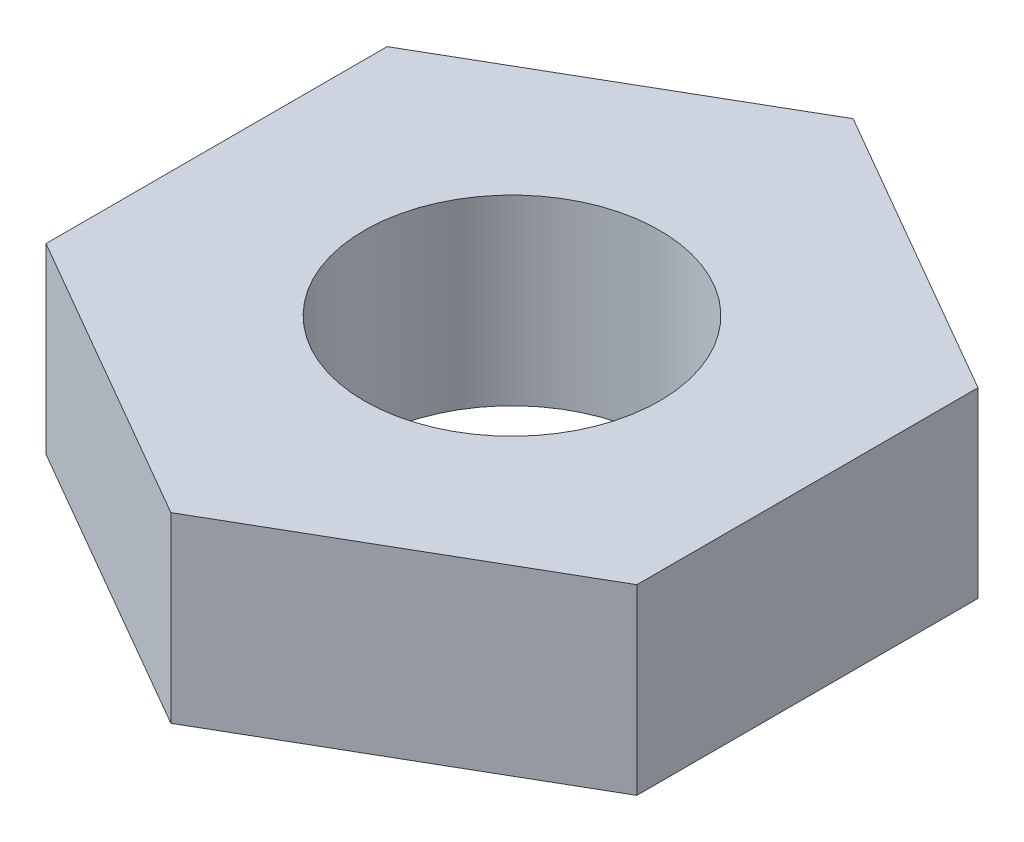
ISO-10303-21;
HEADER;
FILE_DESCRIPTION(('STEP AP214'),'2;1');
FILE_NAME('part.step','',(''),(''),'','','');
FILE_SCHEMA(('AUTOMOTIVE_DESIGN { 1 0 10303 214 1 1 1 1 }'));
ENDSEC;
DATA;
#1=APPLICATION_CONTEXT('core data for automotive mechanical design processes');
#2=APPLICATION_PROTOCOL_DEFINITION('international standard','automotive_design',2000,#1);
#3=PRODUCT_CONTEXT('',#1,'mechanical');
#4=PRODUCT('Part','Part','',(#3));
#5=PRODUCT_RELATED_PRODUCT_CATEGORY('part','',(#4));
#6=PRODUCT_DEFINITION_FORMATION('','',#4);
#7=PRODUCT_DEFINITION_CONTEXT('part definition',#1,'design');
#8=PRODUCT_DEFINITION('design','',#6,#7);
#9=PRODUCT_DEFINITION_SHAPE('','',#8);
#10=(LENGTH_UNIT() NAMED_UNIT(*) SI_UNIT(.MILLI.,.METRE.));
#11=(NAMED_UNIT(*) PLANE_ANGLE_UNIT() SI_UNIT($,.RADIAN.));
#12=(NAMED_UNIT(*) SI_UNIT($,.STERADIAN.) SOLID_ANGLE_UNIT());
#13=UNCERTAINTY_MEASURE_WITH_UNIT(LENGTH_MEASURE(1.E-05),#10,'distance_accuracy_value','');
#14=(GEOMETRIC_REPRESENTATION_CONTEXT(3) GLOBAL_UNCERTAINTY_ASSIGNED_CONTEXT((#13)) GLOBAL_UNIT_ASSIGNED_CONTEXT((#10,
#11,#12)) REPRESENTATION_CONTEXT('',''));
#15=CARTESIAN_POINT('',(0.,0.,0.));
#16=DIRECTION('',(0.,0.,1.));
#17=DIRECTION('',(1.,0.,0.));
#18=AXIS2_PLACEMENT_3D('',#15,#16,#17);
#19=CARTESIAN_POINT('',(-3.4544,2.1336,-1.99439876988864));
#20=DIRECTION('',(0.,1.,0.));
#21=DIRECTION('',(0.,0.,1.));
#22=AXIS2_PLACEMENT_3D('',#19,#20,#21);
#23=PLANE('',#22);
#24=DIRECTION('',(-0.866025403784438,0.,0.500000000000001));
#25=VECTOR('',#24,1.);
#26=CARTESIAN_POINT('',(0.,2.1336,-3.98879753977729));
#27=LINE('',#26,#25);
#28=CARTESIAN_POINT('',(0.,2.1336,-3.98879753977729));
#29=VERTEX_POINT('',#28);
#30=CARTESIAN_POINT('',(-3.4544,2.1336,-1.99439876988864));
#31=VERTEX_POINT('',#30);
#32=EDGE_CURVE('E128',#29,#31,#27,.T.);
#33=ORIENTED_EDGE('',*,*,#32,.T.);
#34=DIRECTION('',(0.,0.,1.));
#35=VECTOR('',#34,1.);
#36=CARTESIAN_POINT('',(-3.4544,2.1336,-1.99439876988864));
#37=LINE('',#36,#35);
#38=CARTESIAN_POINT('',(-3.4544,2.1336,1.99439876988865));
#39=VERTEX_POINT('',#38);
#40=EDGE_CURVE('E86',#31,#39,#37,.T.);
#41=ORIENTED_EDGE('',*,*,#40,.T.);
#42=DIRECTION('',(0.866025403784438,0.,0.500000000000001));
#43=VECTOR('',#42,1.);
#44=CARTESIAN_POINT('',(-3.4544,2.1336,1.99439876988865));
#45=LINE('',#44,#43);
#46=CARTESIAN_POINT('',(0.,2.1336,3.9887975397773));
#47=VERTEX_POINT('',#46);
#48=EDGE_CURVE('E99',#39,#47,#45,.T.);
#49=ORIENTED_EDGE('',*,*,#48,.T.);
#50=DIRECTION('',(0.866025403784438,0.,-0.500000000000001));
#51=VECTOR('',#50,1.);
#52=CARTESIAN_POINT('',(0.,2.1336,3.9887975397773));
#53=LINE('',#52,#51);
#54=CARTESIAN_POINT('',(3.4544,2.1336,1.99439876988865));
#55=VERTEX_POINT('',#54);
#56=EDGE_CURVE('E93',#47,#55,#53,.T.);
#57=ORIENTED_EDGE('',*,*,#56,.T.);
#58=DIRECTION('',(0.,0.,-1.));
#59=VECTOR('',#58,1.);
#60=CARTESIAN_POINT('',(3.4544,2.1336,-1.99439876988864));
#61=LINE('',#60,#59);
#62=CARTESIAN_POINT('',(3.4544,2.1336,-1.99439876988864));
#63=VERTEX_POINT('',#62);
#64=EDGE_CURVE('E97',#55,#63,#61,.T.);
#65=ORIENTED_EDGE('',*,*,#64,.T.);
#66=DIRECTION('',(-0.866025403784438,0.,-0.500000000000001));
#67=VECTOR('',#66,1.);
#68=CARTESIAN_POINT('',(3.4544,2.1336,-1.99439876988864));
#69=LINE('',#68,#67);
#70=EDGE_CURVE('E49',#63,#29,#69,.T.);
#71=ORIENTED_EDGE('',*,*,#70,.T.);
#72=EDGE_LOOP('',(#33,#41,#49,#57,#65,#71));
#73=FACE_BOUND('',#72,.T.);
#74=CARTESIAN_POINT('',(0.,2.1336,0.));
#75=DIRECTION('',(0.,1.,0.));
#76=DIRECTION('',(0.,0.,1.));
#77=AXIS2_PLACEMENT_3D('',#74,#75,#76);
#78=CIRCLE('',#77,1.7272);
#79=CARTESIAN_POINT('',(0.,2.1336,1.7272));
#80=VERTEX_POINT('',#79);
#81=EDGE_CURVE('E121',#80,#80,#78,.T.);
#82=ORIENTED_EDGE('',*,*,#81,.F.);
#83=EDGE_LOOP('',(#82));
#84=FACE_BOUND('',#83,.T.);
#85=ADVANCED_FACE('F32',(#73,#84),#23,.T.);
#86=CARTESIAN_POINT('',(-3.4544,0.,-1.99439876988864));
#87=DIRECTION('',(0.,1.,0.));
#88=DIRECTION('',(0.,0.,1.));
#89=AXIS2_PLACEMENT_3D('',#86,#87,#88);
#90=PLANE('',#89);
#91=DIRECTION('',(-0.866025403784438,0.,0.500000000000001));
#92=VECTOR('',#91,1.);
#93=CARTESIAN_POINT('',(0.,0.,-3.98879753977729));
#94=LINE('',#93,#92);
#95=CARTESIAN_POINT('',(0.,0.,-3.98879753977729));
#96=VERTEX_POINT('',#95);
#97=CARTESIAN_POINT('',(-3.4544,0.,-1.99439876988864));
#98=VERTEX_POINT('',#97);
#99=EDGE_CURVE('E117',#96,#98,#94,.T.);
#100=ORIENTED_EDGE('',*,*,#99,.F.);
#101=DIRECTION('',(-0.866025403784438,0.,-0.500000000000001));
#102=VECTOR('',#101,1.);
#103=CARTESIAN_POINT('',(3.4544,0.,-1.99439876988864));
#104=LINE('',#103,#102);
#105=CARTESIAN_POINT('',(3.4544,0.,-1.99439876988864));
#106=VERTEX_POINT('',#105);
#107=EDGE_CURVE('E78',#106,#96,#104,.T.);
#108=ORIENTED_EDGE('',*,*,#107,.F.);
#109=DIRECTION('',(0.,0.,-1.));
#110=VECTOR('',#109,1.);
#111=CARTESIAN_POINT('',(3.4544,0.,-1.99439876988864));
#112=LINE('',#111,#110);
#113=CARTESIAN_POINT('',(3.4544,0.,1.99439876988865));
#114=VERTEX_POINT('',#113);
#115=EDGE_CURVE('E72',#114,#106,#112,.T.);
#116=ORIENTED_EDGE('',*,*,#115,.F.);
#117=DIRECTION('',(0.866025403784438,0.,-0.500000000000001));
#118=VECTOR('',#117,1.);
#119=CARTESIAN_POINT('',(0.,0.,3.9887975397773));
#120=LINE('',#119,#118);
#121=CARTESIAN_POINT('',(0.,0.,3.9887975397773));
#122=VERTEX_POINT('',#121);
#123=EDGE_CURVE('E107',#122,#114,#120,.T.);
#124=ORIENTED_EDGE('',*,*,#123,.F.);
#125=DIRECTION('',(0.866025403784438,0.,0.500000000000001));
#126=VECTOR('',#125,1.);
#127=CARTESIAN_POINT('',(-3.4544,0.,1.99439876988865));
#128=LINE('',#127,#126);
#129=CARTESIAN_POINT('',(-3.4544,0.,1.99439876988865));
#130=VERTEX_POINT('',#129);
#131=EDGE_CURVE('E123',#130,#122,#128,.T.);
#132=ORIENTED_EDGE('',*,*,#131,.F.);
#133=DIRECTION('',(0.,0.,1.));
#134=VECTOR('',#133,1.);
#135=CARTESIAN_POINT('',(-3.4544,0.,-1.99439876988864));
#136=LINE('',#135,#134);
#137=EDGE_CURVE('E120',#98,#130,#136,.T.);
#138=ORIENTED_EDGE('',*,*,#137,.F.);
#139=EDGE_LOOP('',(#100,#108,#116,#124,#132,#138));
#140=FACE_BOUND('',#139,.T.);
#141=CARTESIAN_POINT('',(0.,0.,0.));
#142=DIRECTION('',(0.,1.,0.));
#143=DIRECTION('',(0.,0.,1.));
#144=AXIS2_PLACEMENT_3D('',#141,#142,#143);
#145=CIRCLE('',#144,1.7272);
#146=CARTESIAN_POINT('',(0.,0.,1.7272));
#147=VERTEX_POINT('',#146);
#148=EDGE_CURVE('E221',#147,#147,#145,.T.);
#149=ORIENTED_EDGE('',*,*,#148,.T.);
#150=EDGE_LOOP('',(#149));
#151=FACE_BOUND('',#150,.T.);
#152=ADVANCED_FACE('F137',(#140,#151),#90,.F.);
#153=CARTESIAN_POINT('',(0.,2.1336,-3.98879753977729));
#154=DIRECTION('',(0.500000000000001,0.,0.866025403784438));
#155=DIRECTION('',(0.866025403784438,0.,-0.500000000000001));
#156=AXIS2_PLACEMENT_3D('',#153,#154,#155);
#157=PLANE('',#156);
#158=ORIENTED_EDGE('',*,*,#99,.T.);
#159=DIRECTION('',(0.,-1.,0.));
#160=VECTOR('',#159,1.);
#161=CARTESIAN_POINT('',(-3.4544,2.1336,-1.99439876988864));
#162=LINE('',#161,#160);
#163=EDGE_CURVE('E11',#31,#98,#162,.T.);
#164=ORIENTED_EDGE('',*,*,#163,.F.);
#165=ORIENTED_EDGE('',*,*,#32,.F.);
#166=DIRECTION('',(0.,-1.,0.));
#167=VECTOR('',#166,1.);
#168=CARTESIAN_POINT('',(0.,2.1336,-3.98879753977729));
#169=LINE('',#168,#167);
#170=EDGE_CURVE('E113',#29,#96,#169,.T.);
#171=ORIENTED_EDGE('',*,*,#170,.T.);
#172=EDGE_LOOP('',(#158,#164,#165,#171));
#173=FACE_BOUND('',#172,.T.);
#174=ADVANCED_FACE('F34',(#173),#157,.F.);
#175=CARTESIAN_POINT('',(-3.4544,2.1336,-1.99439876988864));
#176=DIRECTION('',(1.,0.,0.));
#177=DIRECTION('',(0.,0.,-1.));
#178=AXIS2_PLACEMENT_3D('',#175,#176,#177);
#179=PLANE('',#178);
#180=ORIENTED_EDGE('',*,*,#137,.T.);
#181=DIRECTION('',(0.,-1.,0.));
#182=VECTOR('',#181,1.);
#183=CARTESIAN_POINT('',(-3.4544,2.1336,1.99439876988865));
#184=LINE('',#183,#182);
#185=EDGE_CURVE('E41',#39,#130,#184,.T.);
#186=ORIENTED_EDGE('',*,*,#185,.F.);
#187=ORIENTED_EDGE('',*,*,#40,.F.);
#188=ORIENTED_EDGE('',*,*,#163,.T.);
#189=EDGE_LOOP('',(#180,#186,#187,#188));
#190=FACE_BOUND('',#189,.T.);
#191=ADVANCED_FACE('F162',(#190),#179,.F.);
#192=CARTESIAN_POINT('',(-3.4544,2.1336,1.99439876988865));
#193=DIRECTION('',(0.500000000000001,0.,-0.866025403784438));
#194=DIRECTION('',(-0.866025403784438,0.,-0.500000000000001));
#195=AXIS2_PLACEMENT_3D('',#192,#193,#194);
#196=PLANE('',#195);
#197=ORIENTED_EDGE('',*,*,#131,.T.);
#198=DIRECTION('',(0.,-1.,0.));
#199=VECTOR('',#198,1.);
#200=CARTESIAN_POINT('',(0.,2.1336,3.9887975397773));
#201=LINE('',#200,#199);
#202=EDGE_CURVE('E108',#47,#122,#201,.T.);
#203=ORIENTED_EDGE('',*,*,#202,.F.);
#204=ORIENTED_EDGE('',*,*,#48,.F.);
#205=ORIENTED_EDGE('',*,*,#185,.T.);
#206=EDGE_LOOP('',(#197,#203,#204,#205));
#207=FACE_BOUND('',#206,.T.);
#208=ADVANCED_FACE('F134',(#207),#196,.F.);
#209=CARTESIAN_POINT('',(0.,2.1336,3.9887975397773));
#210=DIRECTION('',(-0.500000000000001,0.,-0.866025403784438));
#211=DIRECTION('',(-0.866025403784438,0.,0.500000000000001));
#212=AXIS2_PLACEMENT_3D('',#209,#210,#211);
#213=PLANE('',#212);
#214=ORIENTED_EDGE('',*,*,#123,.T.);
#215=DIRECTION('',(0.,-1.,0.));
#216=VECTOR('',#215,1.);
#217=CARTESIAN_POINT('',(3.4544,2.1336,1.99439876988865));
#218=LINE('',#217,#216);
#219=EDGE_CURVE('E104',#55,#114,#218,.T.);
#220=ORIENTED_EDGE('',*,*,#219,.F.);
#221=ORIENTED_EDGE('',*,*,#56,.F.);
#222=ORIENTED_EDGE('',*,*,#202,.T.);
#223=EDGE_LOOP('',(#214,#220,#221,#222));
#224=FACE_BOUND('',#223,.T.);
#225=ADVANCED_FACE('F105',(#224),#213,.F.);
#226=CARTESIAN_POINT('',(3.4544,2.1336,-1.99439876988864));
#227=DIRECTION('',(-1.,0.,0.));
#228=DIRECTION('',(0.,0.,1.));
#229=AXIS2_PLACEMENT_3D('',#226,#227,#228);
#230=PLANE('',#229);
#231=ORIENTED_EDGE('',*,*,#115,.T.);
#232=DIRECTION('',(0.,-1.,0.));
#233=VECTOR('',#232,1.);
#234=CARTESIAN_POINT('',(3.4544,2.1336,-1.99439876988864));
#235=LINE('',#234,#233);
#236=EDGE_CURVE('E109',#63,#106,#235,.T.);
#237=ORIENTED_EDGE('',*,*,#236,.F.);
#238=ORIENTED_EDGE('',*,*,#64,.F.);
#239=ORIENTED_EDGE('',*,*,#219,.T.);
#240=EDGE_LOOP('',(#231,#237,#238,#239));
#241=FACE_BOUND('',#240,.T.);
#242=ADVANCED_FACE('F111',(#241),#230,.F.);
#243=CARTESIAN_POINT('',(3.4544,2.1336,-1.99439876988864));
#244=DIRECTION('',(-0.500000000000001,0.,0.866025403784438));
#245=DIRECTION('',(0.866025403784438,0.,0.500000000000001));
#246=AXIS2_PLACEMENT_3D('',#243,#244,#245);
#247=PLANE('',#246);
#248=ORIENTED_EDGE('',*,*,#107,.T.);
#249=ORIENTED_EDGE('',*,*,#170,.F.);
#250=ORIENTED_EDGE('',*,*,#70,.F.);
#251=ORIENTED_EDGE('',*,*,#236,.T.);
#252=EDGE_LOOP('',(#248,#249,#250,#251));
#253=FACE_BOUND('',#252,.T.);
#254=ADVANCED_FACE('F142',(#253),#247,.F.);
#255=CARTESIAN_POINT('',(0.,2.1336,0.));
#256=DIRECTION('',(0.,-1.,0.));
#257=DIRECTION('',(0.,0.,-1.));
#258=AXIS2_PLACEMENT_3D('',#255,#256,#257);
#259=CYLINDRICAL_SURFACE('',#258,1.7272);
#260=ORIENTED_EDGE('',*,*,#81,.T.);
#261=EDGE_LOOP('',(#260));
#262=FACE_BOUND('',#261,.T.);
#263=ORIENTED_EDGE('',*,*,#148,.F.);
#264=EDGE_LOOP('',(#263));
#265=FACE_BOUND('',#264,.T.);
#266=ADVANCED_FACE('F144',(#262,#265),#259,.F.);
#267=CLOSED_SHELL('',(#85,#152,#174,#191,#208,#225,#242,#254,#266));
#268=MANIFOLD_SOLID_BREP('B2',#267);
#269=ADVANCED_BREP_SHAPE_REPRESENTATION('',(#18,#268),#14);
#270=SHAPE_DEFINITION_REPRESENTATION(#9,#269);
ENDSEC;
END-ISO-10303-21;
